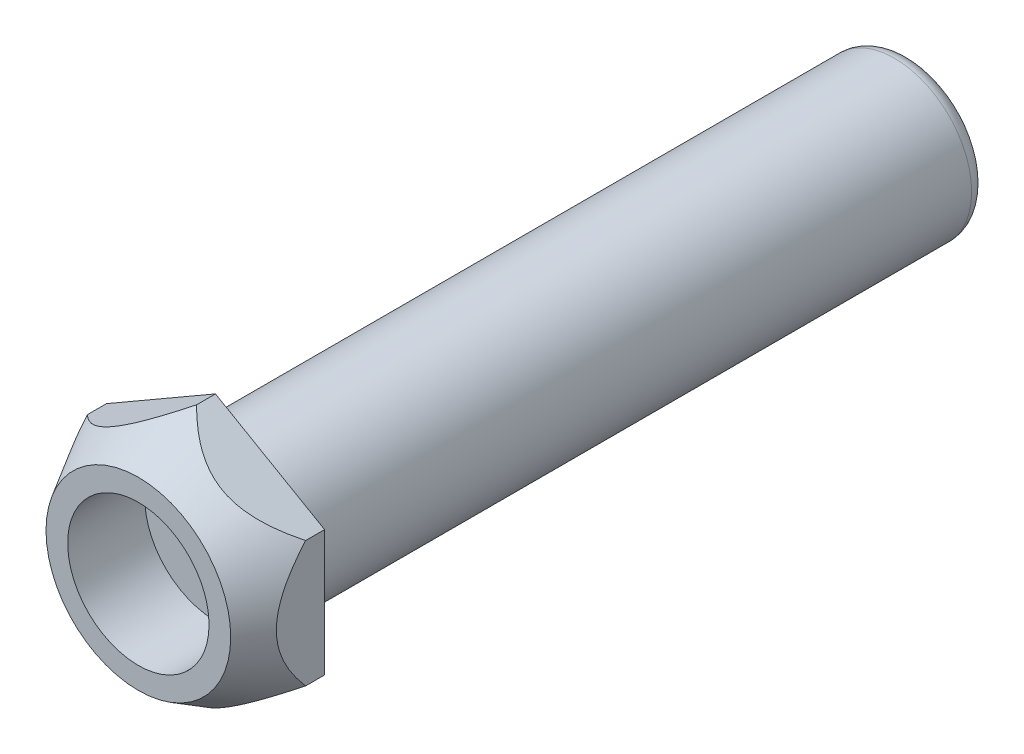
ISO-10303-21;
HEADER;
FILE_DESCRIPTION(('STEP AP214'),'2;1');
FILE_NAME('part.step','',(''),(''),'','','');
FILE_SCHEMA(('AUTOMOTIVE_DESIGN { 1 0 10303 214 1 1 1 1 }'));
ENDSEC;
DATA;
#1=APPLICATION_CONTEXT('core data for automotive mechanical design processes');
#2=APPLICATION_PROTOCOL_DEFINITION('international standard','automotive_design',2000,#1);
#3=PRODUCT_CONTEXT('',#1,'mechanical');
#4=PRODUCT('Part','Part','',(#3));
#5=PRODUCT_RELATED_PRODUCT_CATEGORY('part','',(#4));
#6=PRODUCT_DEFINITION_FORMATION('','',#4);
#7=PRODUCT_DEFINITION_CONTEXT('part definition',#1,'design');
#8=PRODUCT_DEFINITION('design','',#6,#7);
#9=PRODUCT_DEFINITION_SHAPE('','',#8);
#10=(LENGTH_UNIT() NAMED_UNIT(*) SI_UNIT(.MILLI.,.METRE.));
#11=(NAMED_UNIT(*) PLANE_ANGLE_UNIT() SI_UNIT($,.RADIAN.));
#12=(NAMED_UNIT(*) SI_UNIT($,.STERADIAN.) SOLID_ANGLE_UNIT());
#13=UNCERTAINTY_MEASURE_WITH_UNIT(LENGTH_MEASURE(1.E-05),#10,'distance_accuracy_value','');
#14=(GEOMETRIC_REPRESENTATION_CONTEXT(3) GLOBAL_UNCERTAINTY_ASSIGNED_CONTEXT((#13)) GLOBAL_UNIT_ASSIGNED_CONTEXT((#10,
#11,#12)) REPRESENTATION_CONTEXT('',''));
#15=CARTESIAN_POINT('',(0.,0.,0.));
#16=DIRECTION('',(0.,0.,1.));
#17=DIRECTION('',(1.,0.,0.));
#18=AXIS2_PLACEMENT_3D('',#15,#16,#17);
#19=CARTESIAN_POINT('',(1.41363071627622,0.816160074576822,10.));
#20=DIRECTION('',(-0.499999999999995,-0.866025403784441,0.));
#21=DIRECTION('',(0.866025403784442,-0.499999999999995,0.));
#22=AXIS2_PLACEMENT_3D('',#19,#20,#21);
#23=PLANE('',#22);
#24=CARTESIAN_POINT('',(1.41383071627622,0.816044604522984,9.245778281989));
#25=CARTESIAN_POINT('',(1.38425614100578,0.83311949351654,9.27532365935503));
#26=CARTESIAN_POINT('',(1.35409015869044,0.850535831526675,9.30413732051481));
#27=CARTESIAN_POINT('',(1.29219428894102,0.886271428588227,9.35982796014707));
#28=CARTESIAN_POINT('',(1.26045693797109,0.904594996714079,9.38669382478974));
#29=CARTESIAN_POINT('',(1.19450583923613,0.942671881322059,9.43834695421823));
#30=CARTESIAN_POINT('',(1.16024929116499,0.962449908572441,9.46306256360795));
#31=CARTESIAN_POINT('',(1.08989768208299,1.00306742901386,9.50854885324181));
#32=CARTESIAN_POINT('',(1.05380691374877,1.02390444382688,9.52932825096843));
#33=CARTESIAN_POINT('',(0.97640466372232,1.06859265371553,9.56731237644814));
#34=CARTESIAN_POINT('',(0.934913001845885,1.09254787586902,9.58404318937878));
#35=CARTESIAN_POINT('',(0.850404703927267,1.14133876442109,9.60937404665424));
#36=CARTESIAN_POINT('',(0.80740342524014,1.1661655642466,9.61803986142821));
#37=CARTESIAN_POINT('',(0.720330124477487,1.21643735788114,9.62616470344395));
#38=CARTESIAN_POINT('',(0.676251950045994,1.24188590375455,9.62554020648526));
#39=CARTESIAN_POINT('',(0.588868807362534,1.29233658470548,9.6149793979724));
#40=CARTESIAN_POINT('',(0.545566166630254,1.31733737598889,9.60501870163715));
#41=CARTESIAN_POINT('',(0.448727164355875,1.37324740002005,9.57326161446597));
#42=CARTESIAN_POINT('',(0.395846294433655,1.40377818450463,9.5488781335688));
#43=CARTESIAN_POINT('',(0.293822069153136,1.4626818984342,9.49106565081394));
#44=CARTESIAN_POINT('',(0.244697653758156,1.49104389288627,9.45759424609606));
#45=CARTESIAN_POINT('',(0.162518521424671,1.53849003706078,9.39443938206485));
#46=CARTESIAN_POINT('',(0.12865946430821,1.55803857280147,9.36610875447559));
#47=CARTESIAN_POINT('',(0.0629273911500877,1.59598900293371,9.30736563021002));
#48=CARTESIAN_POINT('',(0.0310362061307781,1.61440138718938,9.27698038824923));
#49=CARTESIAN_POINT('',(-0.000199999999999906,1.63243561920745,9.245778281989));
#50=B_SPLINE_CURVE_WITH_KNOTS('',3,(#24,#25,#26,#27,#28,#29,#30,#31,#32,#33,#34,#35,#36,#37,#38,
#39,#40,#41,#42,#43,#44,#45,#46,#47,#48,#49),.UNSPECIFIED.,.F.,.F.,(4,2,2,2,2,2,2,2,2,2,2,2,4),
(0.,0.135515672528433,0.271751997379159,0.411508900210153,0.550952570640002,0.702636958000987,
0.853073225572081,1.00486279583596,1.15704992617521,1.35318163813894,1.55024468173202,
1.69499983896404,1.83811330662084),.UNSPECIFIED.);
#51=CARTESIAN_POINT('',(1.41363071627622,0.816160074576825,9.24597830320945));
#52=VERTEX_POINT('',#51);
#53=CARTESIAN_POINT('',(0.,1.63232014915361,9.24597830320945));
#54=VERTEX_POINT('',#53);
#55=EDGE_CURVE('E89',#52,#54,#50,.T.);
#56=ORIENTED_EDGE('',*,*,#55,.F.);
#57=DIRECTION('',(0.,0.,-1.));
#58=VECTOR('',#57,1.);
#59=CARTESIAN_POINT('',(1.41363071627622,0.816160074576822,10.));
#60=LINE('',#59,#58);
#61=CARTESIAN_POINT('',(1.41363071627622,0.816160074576822,9.));
#62=VERTEX_POINT('',#61);
#63=EDGE_CURVE('E58',#52,#62,#60,.T.);
#64=ORIENTED_EDGE('',*,*,#63,.T.);
#65=DIRECTION('',(-0.866025403784441,0.499999999999995,0.));
#66=VECTOR('',#65,1.);
#67=CARTESIAN_POINT('',(1.41363071627622,0.816160074576822,9.));
#68=LINE('',#67,#66);
#69=CARTESIAN_POINT('',(0.,1.63232014915361,9.));
#70=VERTEX_POINT('',#69);
#71=EDGE_CURVE('E221',#62,#70,#68,.T.);
#72=ORIENTED_EDGE('',*,*,#71,.T.);
#73=DIRECTION('',(0.,0.,-1.));
#74=VECTOR('',#73,1.);
#75=CARTESIAN_POINT('',(0.,1.63232014915361,10.));
#76=LINE('',#75,#74);
#77=EDGE_CURVE('E96',#54,#70,#76,.T.);
#78=ORIENTED_EDGE('',*,*,#77,.F.);
#79=EDGE_LOOP('',(#56,#64,#72,#78));
#80=FACE_BOUND('',#79,.T.);
#81=ADVANCED_FACE('F35',(#80),#23,.F.);
#82=CARTESIAN_POINT('',(0.,1.63232014915361,10.));
#83=DIRECTION('',(0.500000000000001,-0.866025403784438,0.));
#84=DIRECTION('',(0.866025403784438,0.500000000000001,0.));
#85=AXIS2_PLACEMENT_3D('',#82,#83,#84);
#86=PLANE('',#85);
#87=CARTESIAN_POINT('',(0.000199999999999957,1.63243561920745,9.245778281989));
#88=CARTESIAN_POINT('',(-0.0293745752704384,1.61536073021389,9.27532365935503));
#89=CARTESIAN_POINT('',(-0.0595405575857858,1.59794439220376,9.30413732051481));
#90=CARTESIAN_POINT('',(-0.121436427335203,1.5622087951422,9.35982796014707));
#91=CARTESIAN_POINT('',(-0.153173778305128,1.54388522701635,9.38669382478974));
#92=CARTESIAN_POINT('',(-0.219124877040087,1.50580834240837,9.43834695421823));
#93=CARTESIAN_POINT('',(-0.25338142511123,1.48603031515799,9.46306256360795));
#94=CARTESIAN_POINT('',(-0.323733034193232,1.44541279471657,9.50854885324181));
#95=CARTESIAN_POINT('',(-0.359823802527451,1.42457577990355,9.52932825096843));
#96=CARTESIAN_POINT('',(-0.437226052553896,1.3798875700149,9.56731237644814));
#97=CARTESIAN_POINT('',(-0.478717714430331,1.35593234786142,9.58404318937878));
#98=CARTESIAN_POINT('',(-0.563226012348948,1.30714145930934,9.60937404665425));
#99=CARTESIAN_POINT('',(-0.606227291036075,1.28231465948383,9.61803986142822));
#100=CARTESIAN_POINT('',(-0.693300591798728,1.23204286584929,9.62616470344396));
#101=CARTESIAN_POINT('',(-0.737378766230221,1.20659431997588,9.62554020648527));
#102=CARTESIAN_POINT('',(-0.824761908913681,1.15614363902495,9.61497939797241));
#103=CARTESIAN_POINT('',(-0.868064549645961,1.13114284774154,9.60501870163716));
#104=CARTESIAN_POINT('',(-0.964903551920339,1.07523282371037,9.57326161446598));
#105=CARTESIAN_POINT('',(-1.01778442184256,1.0447020392258,9.54887813356882));
#106=CARTESIAN_POINT('',(-1.11980864712308,0.985798325296231,9.49106565081395));
#107=CARTESIAN_POINT('',(-1.16893306251805,0.957436330844157,9.45759424609608));
#108=CARTESIAN_POINT('',(-1.25111219485154,0.909990186669647,9.39443938206487));
#109=CARTESIAN_POINT('',(-1.28497125196801,0.890441650928949,9.3661087544756));
#110=CARTESIAN_POINT('',(-1.35070332512614,0.85249122079671,9.30736563021003));
#111=CARTESIAN_POINT('',(-1.38259451014545,0.834078836541033,9.27698038824923));
#112=CARTESIAN_POINT('',(-1.41383071627623,0.816044604522964,9.245778281989));
#113=B_SPLINE_CURVE_WITH_KNOTS('',3,(#87,#88,#89,#90,#91,#92,#93,#94,#95,#96,#97,#98,#99,#100,
#101,#102,#103,#104,#105,#106,#107,#108,#109,#110,#111,#112),.UNSPECIFIED.,.F.,.F.,(4,2,2,2,2,2,
2,2,2,2,2,2,4),(0.,0.135515672528433,0.271751997379159,0.411508900210152,0.550952570640001,
0.702636958000986,0.85307322557208,1.00486279583596,1.15704992617521,1.35318163813894,
1.55024468173201,1.69499983896405,1.83811330662087),.UNSPECIFIED.);
#114=CARTESIAN_POINT('',(-1.41363071627623,0.816160074576806,9.24597830320945));
#115=VERTEX_POINT('',#114);
#116=EDGE_CURVE('E98',#54,#115,#113,.T.);
#117=ORIENTED_EDGE('',*,*,#116,.F.);
#118=ORIENTED_EDGE('',*,*,#77,.T.);
#119=DIRECTION('',(-0.866025403784438,-0.500000000000001,0.));
#120=VECTOR('',#119,1.);
#121=CARTESIAN_POINT('',(0.,1.63232014915361,9.));
#122=LINE('',#121,#120);
#123=CARTESIAN_POINT('',(-1.41363071627623,0.816160074576802,9.));
#124=VERTEX_POINT('',#123);
#125=EDGE_CURVE('E224',#70,#124,#122,.T.);
#126=ORIENTED_EDGE('',*,*,#125,.T.);
#127=DIRECTION('',(0.,0.,-1.));
#128=VECTOR('',#127,1.);
#129=CARTESIAN_POINT('',(-1.41363071627623,0.816160074576802,10.));
#130=LINE('',#129,#128);
#131=EDGE_CURVE('E115',#115,#124,#130,.T.);
#132=ORIENTED_EDGE('',*,*,#131,.F.);
#133=EDGE_LOOP('',(#117,#118,#126,#132));
#134=FACE_BOUND('',#133,.T.);
#135=ADVANCED_FACE('F137',(#134),#86,.F.);
#136=CARTESIAN_POINT('',(-1.41363071627623,0.816160074576802,10.));
#137=DIRECTION('',(1.,0.,0.));
#138=DIRECTION('',(0.,1.,0.));
#139=AXIS2_PLACEMENT_3D('',#136,#137,#138);
#140=PLANE('',#139);
#141=CARTESIAN_POINT('',(-1.41363071627622,-1.67905290733659,8.27156755066952));
#142=CARTESIAN_POINT('',(-1.41363071627622,-1.64433972294282,8.31755825036936));
#143=CARTESIAN_POINT('',(-1.41363071627622,-1.60934772309907,8.36333645158738));
#144=CARTESIAN_POINT('',(-1.41363071627622,-1.53869136637997,8.45438651279615));
#145=CARTESIAN_POINT('',(-1.41363071627622,-1.50302686501682,8.49965826056778));
#146=CARTESIAN_POINT('',(-1.41363071627622,-1.39420278336073,8.63540065032796));
#147=CARTESIAN_POINT('',(-1.41363071627623,-1.31985613636175,8.72493687729335));
#148=CARTESIAN_POINT('',(-1.41363071627623,-1.20040420037576,8.86155928502252));
#149=CARTESIAN_POINT('',(-1.41363071627623,-1.1568316775646,8.90998379556318));
#150=CARTESIAN_POINT('',(-1.41363071627623,-1.06794149136101,9.00519817209435));
#151=CARTESIAN_POINT('',(-1.41363071627623,-1.02262416626113,9.05198835163671));
#152=CARTESIAN_POINT('',(-1.41363071627623,-0.929973141508732,9.14317779435519));
#153=CARTESIAN_POINT('',(-1.41363071627623,-0.882647932076212,9.18758561657901));
#154=CARTESIAN_POINT('',(-1.41363071627623,-0.785277285747756,9.2732852497112));
#155=CARTESIAN_POINT('',(-1.41363071627623,-0.735233859393239,9.31457931115695));
#156=CARTESIAN_POINT('',(-1.41363071627623,-0.647541028027813,9.38068126748988));
#157=CARTESIAN_POINT('',(-1.41363071627623,-0.610790858794825,9.40666445443446));
#158=CARTESIAN_POINT('',(-1.41363071627623,-0.535407563089157,9.45573193352089));
#159=CARTESIAN_POINT('',(-1.41363071627623,-0.496773352421217,9.47881452849141));
#160=CARTESIAN_POINT('',(-1.41363071627623,-0.379235024452393,9.54139912297399));
#161=CARTESIAN_POINT('',(-1.41363071627623,-0.297102270575759,9.57553490232616));
#162=CARTESIAN_POINT('',(-1.41363071627623,-0.164947643503545,9.60945613007413));
#163=CARTESIAN_POINT('',(-1.41363071627623,-0.117135854995222,9.61778915185238));
#164=CARTESIAN_POINT('',(-1.41363071627623,-0.0207241784356564,9.62591174161212));
#165=CARTESIAN_POINT('',(-1.41363071627623,0.0278760682234975,9.6256973065647));
#166=CARTESIAN_POINT('',(-1.41363071627623,0.124107917844637,9.61675126259581));
#167=CARTESIAN_POINT('',(-1.41363071627623,0.171741877170197,9.6080438122772));
#168=CARTESIAN_POINT('',(-1.41363071627623,0.265084706082082,9.58337017562073));
#169=CARTESIAN_POINT('',(-1.41363071627623,0.310791179201756,9.56739522830039));
#170=CARTESIAN_POINT('',(-1.41363071627623,0.393133274254891,9.53263696482176));
#171=CARTESIAN_POINT('',(-1.41363071627623,0.430105745409773,9.51462671915031));
#172=CARTESIAN_POINT('',(-1.41363071627623,0.502348495388917,9.47543593921672));
#173=CARTESIAN_POINT('',(-1.41363071627623,0.537617390876578,9.45425288395955));
#174=CARTESIAN_POINT('',(-1.41363071627623,0.606909366464346,9.40923068058328));
#175=CARTESIAN_POINT('',(-1.41363071627623,0.640916130581831,9.38536671296083));
#176=CARTESIAN_POINT('',(-1.41363071627623,0.70747475805378,9.33573760625262));
#177=CARTESIAN_POINT('',(-1.41363071627623,0.740027291661078,9.30997335782715));
#178=CARTESIAN_POINT('',(-1.41363071627623,0.831306186739143,9.23421057091305));
#179=CARTESIAN_POINT('',(-1.41363071627623,0.888517330432571,9.18239134897363));
#180=CARTESIAN_POINT('',(-1.41363071627623,0.999733307525385,9.07539615519459));
#181=CARTESIAN_POINT('',(-1.41363071627623,1.05373540917745,9.02021740215118));
#182=CARTESIAN_POINT('',(-1.41363071627623,1.15946313014512,8.90734215360245));
#183=CARTESIAN_POINT('',(-1.41363071627623,1.21117938529195,8.84963693925886));
#184=CARTESIAN_POINT('',(-1.41363071627623,1.31268462371257,8.73255352108331));
#185=CARTESIAN_POINT('',(-1.41363071627623,1.36247334631048,8.67317509283224));
#186=CARTESIAN_POINT('',(-1.41363071627623,1.45657765512383,8.55800663468814));
#187=CARTESIAN_POINT('',(-1.41363071627623,1.50101117203878,8.50231255727611));
#188=CARTESIAN_POINT('',(-1.41363071627624,1.58882865089946,8.39009550465013));
#189=CARTESIAN_POINT('',(-1.41363071627624,1.63221250197877,8.33357244288222));
#190=CARTESIAN_POINT('',(-1.41363071627624,1.7177239819946,8.22038143664004));
#191=CARTESIAN_POINT('',(-1.41363071627624,1.75985939607326,8.16371935796784));
#192=CARTESIAN_POINT('',(-1.41363071627624,1.84339896046617,8.04987703434243));
#193=CARTESIAN_POINT('',(-1.41363071627624,1.88480326665836,7.99269690387368));
#194=CARTESIAN_POINT('',(-1.41363071627624,1.92591280094488,7.93530839793996));
#195=B_SPLINE_CURVE_WITH_KNOTS('',3,(#141,#142,#143,#144,#145,#146,#147,#148,#149,#150,#151,
#152,#153,#154,#155,#156,#157,#158,#159,#160,#161,#162,#163,#164,#165,#166,#167,#168,#169,#170,
#171,#172,#173,#174,#175,#176,#177,#178,#179,#180,#181,#182,#183,#184,#185,#186,#187,#188,#189,
#190,#191,#192,#193,#194),.UNSPECIFIED.,.F.,.F.,(4,2,2,2,2,2,2,2,2,2,2,2,2,2,2,2,2,2,2,2,2,2,2,
2,2,2,4),(0.,0.172856779133159,0.345751129753997,0.694764818367423,0.890159904291273,
1.0855172947785,1.28011798063293,1.47457663897939,1.60946765115293,1.7444372257759,
2.00827760729503,2.15321273123484,2.29821573341235,2.44280747008501,2.58757397617742,
2.71077096669131,2.8340663693338,2.95861557424437,3.0831067695178,3.31444645232385,
3.54598032585764,3.77838831603819,4.01082762761954,4.22455434898042,4.43830354661753,
4.65013203985738,4.86191481057648),.UNSPECIFIED.);
#196=CARTESIAN_POINT('',(-1.41363071627623,-0.816160074576812,9.24597830320945));
#197=VERTEX_POINT('',#196);
#198=EDGE_CURVE('E190',#115,#197,#195,.F.);
#199=ORIENTED_EDGE('',*,*,#198,.F.);
#200=ORIENTED_EDGE('',*,*,#131,.T.);
#201=DIRECTION('',(0.,-1.,0.));
#202=VECTOR('',#201,1.);
#203=CARTESIAN_POINT('',(-1.41363071627623,0.816160074576802,9.));
#204=LINE('',#203,#202);
#205=CARTESIAN_POINT('',(-1.41363071627623,-0.816160074576812,9.));
#206=VERTEX_POINT('',#205);
#207=EDGE_CURVE('E227',#124,#206,#204,.T.);
#208=ORIENTED_EDGE('',*,*,#207,.T.);
#209=DIRECTION('',(0.,0.,-1.));
#210=VECTOR('',#209,1.);
#211=CARTESIAN_POINT('',(-1.41363071627623,-0.816160074576812,10.));
#212=LINE('',#211,#210);
#213=EDGE_CURVE('E113',#197,#206,#212,.T.);
#214=ORIENTED_EDGE('',*,*,#213,.F.);
#215=EDGE_LOOP('',(#199,#200,#208,#214));
#216=FACE_BOUND('',#215,.T.);
#217=ADVANCED_FACE('F142',(#216),#140,.F.);
#218=CARTESIAN_POINT('',(-1.41363071627623,-0.816160074576812,10.));
#219=DIRECTION('',(0.499999999999995,0.866025403784441,0.));
#220=DIRECTION('',(-0.866025403784442,0.499999999999995,0.));
#221=AXIS2_PLACEMENT_3D('',#218,#219,#220);
#222=PLANE('',#221);
#223=CARTESIAN_POINT('',(-1.41383071627623,-0.816044604522974,9.245778281989));
#224=CARTESIAN_POINT('',(-1.38425614100579,-0.83311949351653,9.27532365935503));
#225=CARTESIAN_POINT('',(-1.35409015869044,-0.850535831526665,9.30413732051481));
#226=CARTESIAN_POINT('',(-1.29219428894102,-0.886271428588217,9.35982796014707));
#227=CARTESIAN_POINT('',(-1.2604569379711,-0.90459499671407,9.38669382478974));
#228=CARTESIAN_POINT('',(-1.19450583923614,-0.942671881322049,9.43834695421823));
#229=CARTESIAN_POINT('',(-1.16024929116499,-0.962449908572431,9.46306256360795));
#230=CARTESIAN_POINT('',(-1.08989768208299,-1.00306742901385,9.50854885324181));
#231=CARTESIAN_POINT('',(-1.05380691374877,-1.02390444382687,9.52932825096843));
#232=CARTESIAN_POINT('',(-0.976404663722329,-1.06859265371552,9.56731237644814));
#233=CARTESIAN_POINT('',(-0.934913001845895,-1.092547875869,9.58404318937878));
#234=CARTESIAN_POINT('',(-0.850404703927276,-1.14133876442107,9.60937404665425));
#235=CARTESIAN_POINT('',(-0.807403425240149,-1.16616556424658,9.61803986142822));
#236=CARTESIAN_POINT('',(-0.720330124477496,-1.21643735788113,9.62616470344396));
#237=CARTESIAN_POINT('',(-0.676251950046003,-1.24188590375454,9.62554020648527));
#238=CARTESIAN_POINT('',(-0.588868807362542,-1.29233658470547,9.61497939797241));
#239=CARTESIAN_POINT('',(-0.545566166630262,-1.31733737598887,9.60501870163716));
#240=CARTESIAN_POINT('',(-0.448727164355883,-1.37324740002004,9.57326161446598));
#241=CARTESIAN_POINT('',(-0.395846294433664,-1.40377818450461,9.54887813356882));
#242=CARTESIAN_POINT('',(-0.293822069153148,-1.46268189843418,9.49106565081395));
#243=CARTESIAN_POINT('',(-0.244697653758168,-1.49104389288626,9.45759424609608));
#244=CARTESIAN_POINT('',(-0.162518521424679,-1.53849003706077,9.39443938206487));
#245=CARTESIAN_POINT('',(-0.128659464308214,-1.55803857280146,9.3661087544756));
#246=CARTESIAN_POINT('',(-0.0629273911500826,-1.5959890029337,9.30736563021003));
#247=CARTESIAN_POINT('',(-0.0310362061307695,-1.61440138718938,9.27698038824923));
#248=CARTESIAN_POINT('',(0.000200000000011592,-1.63243561920745,9.245778281989));
#249=B_SPLINE_CURVE_WITH_KNOTS('',3,(#223,#224,#225,#226,#227,#228,#229,#230,#231,#232,#233,
#234,#235,#236,#237,#238,#239,#240,#241,#242,#243,#244,#245,#246,#247,#248),.UNSPECIFIED.,.F.,
.F.,(4,2,2,2,2,2,2,2,2,2,2,2,4),(0.,0.135515672528434,0.271751997379161,0.411508900210154,
0.550952570640001,0.702636958000987,0.853073225572081,1.00486279583596,1.15704992617521,
1.35318163813894,1.55024468173201,1.69499983896405,1.83811330662087),.UNSPECIFIED.);
#250=CARTESIAN_POINT('',(0.,-1.63232014915361,9.24597830320945));
#251=VERTEX_POINT('',#250);
#252=EDGE_CURVE('E185',#197,#251,#249,.T.);
#253=ORIENTED_EDGE('',*,*,#252,.F.);
#254=ORIENTED_EDGE('',*,*,#213,.T.);
#255=DIRECTION('',(0.866025403784441,-0.499999999999995,0.));
#256=VECTOR('',#255,1.);
#257=CARTESIAN_POINT('',(-1.41363071627623,-0.816160074576812,9.));
#258=LINE('',#257,#256);
#259=CARTESIAN_POINT('',(0.,-1.63232014915361,9.));
#260=VERTEX_POINT('',#259);
#261=EDGE_CURVE('E230',#206,#260,#258,.T.);
#262=ORIENTED_EDGE('',*,*,#261,.T.);
#263=DIRECTION('',(0.,0.,-1.));
#264=VECTOR('',#263,1.);
#265=CARTESIAN_POINT('',(0.,-1.63232014915361,10.));
#266=LINE('',#265,#264);
#267=EDGE_CURVE('E106',#251,#260,#266,.T.);
#268=ORIENTED_EDGE('',*,*,#267,.F.);
#269=EDGE_LOOP('',(#253,#254,#262,#268));
#270=FACE_BOUND('',#269,.T.);
#271=ADVANCED_FACE('F196',(#270),#222,.F.);
#272=CARTESIAN_POINT('',(0.,-1.63232014915361,10.));
#273=DIRECTION('',(-0.500000000000007,0.866025403784434,0.));
#274=DIRECTION('',(-0.866025403784434,-0.500000000000007,0.));
#275=AXIS2_PLACEMENT_3D('',#272,#273,#274);
#276=PLANE('',#275);
#277=CARTESIAN_POINT('',(-0.000199999999988556,-1.63243561920745,9.245778281989));
#278=CARTESIAN_POINT('',(0.0293745752704493,-1.61536073021389,9.27532365935503));
#279=CARTESIAN_POINT('',(0.0595405575857969,-1.59794439220376,9.30413732051481));
#280=CARTESIAN_POINT('',(0.121436427335215,-1.5622087951422,9.35982796014707));
#281=CARTESIAN_POINT('',(0.15317377830514,-1.54388522701635,9.38669382478974));
#282=CARTESIAN_POINT('',(0.219124877040098,-1.50580834240837,9.43834695421823));
#283=CARTESIAN_POINT('',(0.253381425111242,-1.48603031515799,9.46306256360795));
#284=CARTESIAN_POINT('',(0.323733034193242,-1.44541279471657,9.50854885324181));
#285=CARTESIAN_POINT('',(0.359823802527461,-1.42457577990355,9.52932825096843));
#286=CARTESIAN_POINT('',(0.437226052553905,-1.3798875700149,9.56731237644814));
#287=CARTESIAN_POINT('',(0.47871771443034,-1.35593234786141,9.58404318937878));
#288=CARTESIAN_POINT('',(0.563226012348957,-1.30714145930934,9.60937404665425));
#289=CARTESIAN_POINT('',(0.606227291036084,-1.28231465948383,9.61803986142822));
#290=CARTESIAN_POINT('',(0.693300591798736,-1.23204286584928,9.62616470344396));
#291=CARTESIAN_POINT('',(0.737378766230228,-1.20659431997587,9.62554020648527));
#292=CARTESIAN_POINT('',(0.824761908913688,-1.15614363902494,9.61497939797241));
#293=CARTESIAN_POINT('',(0.868064549645967,-1.13114284774154,9.60501870163716));
#294=CARTESIAN_POINT('',(0.964903551920345,-1.07523282371037,9.57326161446598));
#295=CARTESIAN_POINT('',(1.01778442184256,-1.04470203922579,9.54887813356882));
#296=CARTESIAN_POINT('',(1.11980864712308,-0.985798325296225,9.49106565081396));
#297=CARTESIAN_POINT('',(1.16893306251806,-0.95743633084415,9.45759424609609));
#298=CARTESIAN_POINT('',(1.25111219485155,-0.90999018666964,9.39443938206487));
#299=CARTESIAN_POINT('',(1.28497125196801,-0.890441650928942,9.36610875447561));
#300=CARTESIAN_POINT('',(1.35070332512614,-0.852491220796702,9.30736563021003));
#301=CARTESIAN_POINT('',(1.38259451014546,-0.834078836541024,9.27698038824924));
#302=CARTESIAN_POINT('',(1.41383071627624,-0.816044604522955,9.24577828198901));
#303=B_SPLINE_CURVE_WITH_KNOTS('',3,(#277,#278,#279,#280,#281,#282,#283,#284,#285,#286,#287,
#288,#289,#290,#291,#292,#293,#294,#295,#296,#297,#298,#299,#300,#301,#302),.UNSPECIFIED.,.F.,
.F.,(4,2,2,2,2,2,2,2,2,2,2,2,4),(0.,0.135515672528434,0.271751997379161,0.411508900210153,
0.550952570640001,0.702636958000986,0.85307322557208,1.00486279583596,1.15704992617521,
1.35318163813893,1.55024468173201,1.69499983896404,1.83811330662087),.UNSPECIFIED.);
#304=CARTESIAN_POINT('',(1.41363071627624,-0.816160074576792,9.24597830320945));
#305=VERTEX_POINT('',#304);
#306=EDGE_CURVE('E50',#251,#305,#303,.T.);
#307=ORIENTED_EDGE('',*,*,#306,.F.);
#308=ORIENTED_EDGE('',*,*,#267,.T.);
#309=DIRECTION('',(0.866025403784434,0.500000000000007,0.));
#310=VECTOR('',#309,1.);
#311=CARTESIAN_POINT('',(0.,-1.63232014915361,9.));
#312=LINE('',#311,#310);
#313=CARTESIAN_POINT('',(1.41363071627624,-0.816160074576792,9.));
#314=VERTEX_POINT('',#313);
#315=EDGE_CURVE('E108',#260,#314,#312,.T.);
#316=ORIENTED_EDGE('',*,*,#315,.T.);
#317=DIRECTION('',(0.,0.,-1.));
#318=VECTOR('',#317,1.);
#319=CARTESIAN_POINT('',(1.41363071627624,-0.816160074576792,10.));
#320=LINE('',#319,#318);
#321=EDGE_CURVE('E104',#305,#314,#320,.T.);
#322=ORIENTED_EDGE('',*,*,#321,.F.);
#323=EDGE_LOOP('',(#307,#308,#316,#322));
#324=FACE_BOUND('',#323,.T.);
#325=ADVANCED_FACE('F200',(#324),#276,.F.);
#326=CARTESIAN_POINT('',(1.41363071627624,-0.816160074576792,10.));
#327=DIRECTION('',(-1.,0.,0.));
#328=DIRECTION('',(0.,-1.,0.));
#329=AXIS2_PLACEMENT_3D('',#326,#327,#328);
#330=PLANE('',#329);
#331=CARTESIAN_POINT('',(1.41363071627625,-1.67905290964422,8.27156754761191));
#332=CARTESIAN_POINT('',(1.41363071627625,-1.64433972519133,8.31755824741631));
#333=CARTESIAN_POINT('',(1.41363071627625,-1.60934772528823,8.36333644873882));
#334=CARTESIAN_POINT('',(1.41363071627625,-1.53869136844975,8.45438651015643));
#335=CARTESIAN_POINT('',(1.41363071627625,-1.50302686702658,8.49965825803238));
#336=CARTESIAN_POINT('',(1.41363071627624,-1.39420278518643,8.63540064810901));
#337=CARTESIAN_POINT('',(1.41363071627624,-1.31985613806205,8.72493687528601));
#338=CARTESIAN_POINT('',(1.41363071627624,-1.20040420185405,8.86155928336646));
#339=CARTESIAN_POINT('',(1.41363071627624,-1.15683167894806,8.90998379404733));
#340=CARTESIAN_POINT('',(1.41363071627624,-1.06794149254959,9.00519817085525));
#341=CARTESIAN_POINT('',(1.41363071627624,-1.02262416734967,9.05198835053412));
#342=CARTESIAN_POINT('',(1.41363071627624,-0.929973142390458,9.14317779351844));
#343=CARTESIAN_POINT('',(1.41363071627624,-0.882647932851223,9.18758561587163));
#344=CARTESIAN_POINT('',(1.41363071627624,-0.785277286298432,9.27328524925185));
#345=CARTESIAN_POINT('',(1.41363071627624,-0.73523385982631,9.31457931081628));
#346=CARTESIAN_POINT('',(1.41363071627624,-0.647541028293768,9.38068126729919));
#347=CARTESIAN_POINT('',(1.41363071627624,-0.610790859017608,9.4066644542829));
#348=CARTESIAN_POINT('',(1.41363071627624,-0.535407563221176,9.45573193344154));
#349=CARTESIAN_POINT('',(1.41363071627623,-0.496773352505635,9.47881452844512));
#350=CARTESIAN_POINT('',(1.41363071627623,-0.37923502439315,9.54139912300811));
#351=CARTESIAN_POINT('',(1.41363071627623,-0.29710227041215,9.57553490239561));
#352=CARTESIAN_POINT('',(1.41363071627623,-0.164947643236581,9.60945613012755));
#353=CARTESIAN_POINT('',(1.41363071627623,-0.117135854735336,9.61778915188909));
#354=CARTESIAN_POINT('',(1.41363071627623,-0.0207241781924254,9.62591174161785));
#355=CARTESIAN_POINT('',(1.41363071627623,0.0278760684571581,9.62569730655607));
#356=CARTESIAN_POINT('',(1.41363071627623,0.124107918056507,9.61675126256303));
#357=CARTESIAN_POINT('',(1.41363071627623,0.171741877369864,9.60804381223475));
#358=CARTESIAN_POINT('',(1.41363071627623,0.265084706257004,9.58337017556412));
#359=CARTESIAN_POINT('',(1.41363071627623,0.310791179364139,9.56739522823932));
#360=CARTESIAN_POINT('',(1.41363071627623,0.393133274415195,9.53263696474773));
#361=CARTESIAN_POINT('',(1.41363071627623,0.43010574557946,9.51462671906503));
#362=CARTESIAN_POINT('',(1.41363071627622,0.502348495576405,9.47543593910825));
#363=CARTESIAN_POINT('',(1.41363071627622,0.537617391072483,9.45425288383914));
#364=CARTESIAN_POINT('',(1.41363071627622,0.606909366676528,9.40923068043849));
#365=CARTESIAN_POINT('',(1.41363071627622,0.640916130801864,9.38536671280362));
#366=CARTESIAN_POINT('',(1.41363071627622,0.707474758289006,9.33573760607042));
#367=CARTESIAN_POINT('',(1.41363071627622,0.740027291903645,9.3099733576324));
#368=CARTESIAN_POINT('',(1.41363071627622,0.831306187021709,9.23421057066623));
#369=CARTESIAN_POINT('',(1.41363071627622,0.888517330745999,9.1823913486856));
#370=CARTESIAN_POINT('',(1.41363071627622,0.999733307898202,9.07539615482251));
#371=CARTESIAN_POINT('',(1.41363071627622,1.05373540957879,9.02021740173629));
#372=CARTESIAN_POINT('',(1.41363071627622,1.15946313060218,8.90734215310092));
#373=CARTESIAN_POINT('',(1.41363071627622,1.21117938577619,8.84963693871354));
#374=CARTESIAN_POINT('',(1.41363071627622,1.31268462425025,8.73255352044995));
#375=CARTESIAN_POINT('',(1.41363071627622,1.36247334687442,8.67317509215465));
#376=CARTESIAN_POINT('',(1.41363071627621,1.45657765573619,8.5580066339272));
#377=CARTESIAN_POINT('',(1.41363071627621,1.50101117267338,8.50231255647609));
#378=CARTESIAN_POINT('',(1.41363071627621,1.58882865157827,8.39009550377188));
#379=CARTESIAN_POINT('',(1.41363071627621,1.63221250267955,8.33357244196482));
#380=CARTESIAN_POINT('',(1.41363071627621,1.71772398273893,8.22038143564467));
#381=CARTESIAN_POINT('',(1.41363071627621,1.75985939683919,8.16371935693365));
#382=CARTESIAN_POINT('',(1.41363071627621,1.84339896127517,8.04987703323059));
#383=CARTESIAN_POINT('',(1.41363071627621,1.88480326748883,7.99269690272301));
#384=CARTESIAN_POINT('',(1.41363071627621,1.92591280179678,7.93530839675048));
#385=B_SPLINE_CURVE_WITH_KNOTS('',3,(#331,#332,#333,#334,#335,#336,#337,#338,#339,#340,#341,
#342,#343,#344,#345,#346,#347,#348,#349,#350,#351,#352,#353,#354,#355,#356,#357,#358,#359,#360,
#361,#362,#363,#364,#365,#366,#367,#368,#369,#370,#371,#372,#373,#374,#375,#376,#377,#378,#379,
#380,#381,#382,#383,#384),.UNSPECIFIED.,.F.,.F.,(4,2,2,2,2,2,2,2,2,2,2,2,2,2,2,2,2,2,2,2,2,2,2,
2,2,2,4),(0.,0.172856779490362,0.345751130468499,0.694764819810672,0.890159906237475,
1.0855172972275,1.28011798358061,1.47457664242471,1.60946765477137,1.74443722956782,
2.0082776114042,2.1532127353146,2.29821573746407,2.44280747410662,2.58757398016852,
2.71077097072239,2.83406637340497,2.95861557835623,3.0831067736703,3.3144464566278,
3.54598033031323,3.77838832064606,4.0108276323797,4.22455435387385,4.43830355164424,
4.65013204501623,4.86191481586744),.UNSPECIFIED.);
#386=EDGE_CURVE('E87',#305,#52,#385,.T.);
#387=ORIENTED_EDGE('',*,*,#386,.F.);
#388=ORIENTED_EDGE('',*,*,#321,.T.);
#389=DIRECTION('',(0.,1.,0.));
#390=VECTOR('',#389,1.);
#391=CARTESIAN_POINT('',(1.41363071627624,-0.816160074576792,9.));
#392=LINE('',#391,#390);
#393=EDGE_CURVE('E102',#314,#62,#392,.T.);
#394=ORIENTED_EDGE('',*,*,#393,.T.);
#395=ORIENTED_EDGE('',*,*,#63,.F.);
#396=EDGE_LOOP('',(#387,#388,#394,#395));
#397=FACE_BOUND('',#396,.T.);
#398=ADVANCED_FACE('F100',(#397),#330,.F.);
#399=CARTESIAN_POINT('',(0.,0.,9.));
#400=DIRECTION('',(0.,0.,-1.));
#401=DIRECTION('',(-1.,0.,0.));
#402=AXIS2_PLACEMENT_3D('',#399,#400,#401);
#403=CYLINDRICAL_SURFACE('',#402,1.);
#404=CARTESIAN_POINT('',(0.,0.,0.200000000000001));
#405=DIRECTION('',(0.,0.,1.));
#406=DIRECTION('',(1.,0.,0.));
#407=AXIS2_PLACEMENT_3D('',#404,#405,#406);
#408=CIRCLE('',#407,1.);
#409=CARTESIAN_POINT('',(1.,0.,0.200000000000001));
#410=VERTEX_POINT('',#409);
#411=EDGE_CURVE('E43',#410,#410,#408,.T.);
#412=ORIENTED_EDGE('',*,*,#411,.T.);
#413=EDGE_LOOP('',(#412));
#414=FACE_BOUND('',#413,.T.);
#415=CARTESIAN_POINT('',(0.,0.,9.));
#416=DIRECTION('',(0.,0.,1.));
#417=DIRECTION('',(1.,0.,0.));
#418=AXIS2_PLACEMENT_3D('',#415,#416,#417);
#419=CIRCLE('',#418,1.);
#420=CARTESIAN_POINT('',(1.,0.,9.));
#421=VERTEX_POINT('',#420);
#422=EDGE_CURVE('E118',#421,#421,#419,.T.);
#423=ORIENTED_EDGE('',*,*,#422,.F.);
#424=EDGE_LOOP('',(#423));
#425=FACE_BOUND('',#424,.T.);
#426=ADVANCED_FACE('F123',(#414,#425),#403,.T.);
#427=CARTESIAN_POINT('',(0.,0.,0.));
#428=DIRECTION('',(0.,0.,1.));
#429=DIRECTION('',(1.,0.,0.));
#430=AXIS2_PLACEMENT_3D('',#427,#428,#429);
#431=PLANE('',#430);
#432=CARTESIAN_POINT('',(0.,0.,0.));
#433=DIRECTION('',(0.,0.,1.));
#434=DIRECTION('',(1.,0.,0.));
#435=AXIS2_PLACEMENT_3D('',#432,#433,#434);
#436=CIRCLE('',#435,0.8);
#437=CARTESIAN_POINT('',(0.8,0.,0.));
#438=VERTEX_POINT('',#437);
#439=EDGE_CURVE('E12',#438,#438,#436,.F.);
#440=ORIENTED_EDGE('',*,*,#439,.T.);
#441=EDGE_LOOP('',(#440));
#442=FACE_BOUND('',#441,.T.);
#443=ADVANCED_FACE('F149',(#442),#431,.F.);
#444=CARTESIAN_POINT('',(0.,0.,9.));
#445=DIRECTION('',(0.,0.,1.));
#446=DIRECTION('',(1.,0.,0.));
#447=AXIS2_PLACEMENT_3D('',#444,#445,#446);
#448=PLANE('',#447);
#449=ORIENTED_EDGE('',*,*,#422,.T.);
#450=EDGE_LOOP('',(#449));
#451=FACE_BOUND('',#450,.T.);
#452=ORIENTED_EDGE('',*,*,#71,.F.);
#453=ORIENTED_EDGE('',*,*,#393,.F.);
#454=ORIENTED_EDGE('',*,*,#315,.F.);
#455=ORIENTED_EDGE('',*,*,#261,.F.);
#456=ORIENTED_EDGE('',*,*,#207,.F.);
#457=ORIENTED_EDGE('',*,*,#125,.F.);
#458=EDGE_LOOP('',(#452,#453,#454,#455,#456,#457));
#459=FACE_BOUND('',#458,.T.);
#460=ADVANCED_FACE('F166',(#451,#459),#448,.F.);
#461=CARTESIAN_POINT('',(0.,0.,10.));
#462=DIRECTION('',(0.,0.,-1.));
#463=DIRECTION('',(1.,0.,0.));
#464=AXIS2_PLACEMENT_3D('',#461,#462,#463);
#465=CONICAL_SURFACE('',#464,1.19698551953677,0.5235987755983);
#466=CARTESIAN_POINT('',(0.,0.,10.));
#467=DIRECTION('',(0.,0.,1.));
#468=DIRECTION('',(1.,0.,0.));
#469=AXIS2_PLACEMENT_3D('',#466,#467,#468);
#470=CIRCLE('',#469,1.19698551953677);
#471=CARTESIAN_POINT('',(1.19698551953677,0.,10.));
#472=VERTEX_POINT('',#471);
#473=EDGE_CURVE('E93',#472,#472,#470,.T.);
#474=ORIENTED_EDGE('',*,*,#473,.F.);
#475=EDGE_LOOP('',(#474));
#476=FACE_BOUND('',#475,.T.);
#477=ORIENTED_EDGE('',*,*,#55,.T.);
#478=ORIENTED_EDGE('',*,*,#116,.T.);
#479=ORIENTED_EDGE('',*,*,#198,.T.);
#480=ORIENTED_EDGE('',*,*,#252,.T.);
#481=ORIENTED_EDGE('',*,*,#306,.T.);
#482=ORIENTED_EDGE('',*,*,#386,.T.);
#483=EDGE_LOOP('',(#477,#478,#479,#480,#481,#482));
#484=FACE_BOUND('',#483,.T.);
#485=ADVANCED_FACE('F88',(#476,#484),#465,.T.);
#486=CARTESIAN_POINT('',(0.,0.,9.));
#487=DIRECTION('',(0.,0.,1.));
#488=DIRECTION('',(1.,0.,0.));
#489=AXIS2_PLACEMENT_3D('',#486,#487,#488);
#490=PLANE('',#489);
#491=CARTESIAN_POINT('',(0.,0.,9.));
#492=DIRECTION('',(0.,0.,1.));
#493=DIRECTION('',(1.,0.,0.));
#494=AXIS2_PLACEMENT_3D('',#491,#492,#493);
#495=CIRCLE('',#494,0.91623072822091);
#496=CARTESIAN_POINT('',(0.91623072822091,0.,9.));
#497=VERTEX_POINT('',#496);
#498=EDGE_CURVE('E160',#497,#497,#495,.T.);
#499=ORIENTED_EDGE('',*,*,#498,.T.);
#500=EDGE_LOOP('',(#499));
#501=FACE_BOUND('',#500,.T.);
#502=ADVANCED_FACE('F165',(#501),#490,.T.);
#503=CARTESIAN_POINT('',(0.,0.,9.));
#504=DIRECTION('',(0.,0.,1.));
#505=DIRECTION('',(1.,0.,0.));
#506=AXIS2_PLACEMENT_3D('',#503,#504,#505);
#507=CYLINDRICAL_SURFACE('',#506,0.91623072822091);
#508=ORIENTED_EDGE('',*,*,#498,.F.);
#509=EDGE_LOOP('',(#508));
#510=FACE_BOUND('',#509,.T.);
#511=CARTESIAN_POINT('',(0.,0.,10.));
#512=DIRECTION('',(0.,0.,1.));
#513=DIRECTION('',(1.,0.,0.));
#514=AXIS2_PLACEMENT_3D('',#511,#512,#513);
#515=CIRCLE('',#514,0.91623072822091);
#516=CARTESIAN_POINT('',(0.91623072822091,0.,10.));
#517=VERTEX_POINT('',#516);
#518=EDGE_CURVE('E97',#517,#517,#515,.T.);
#519=ORIENTED_EDGE('',*,*,#518,.T.);
#520=EDGE_LOOP('',(#519));
#521=FACE_BOUND('',#520,.T.);
#522=ADVANCED_FACE('F132',(#510,#521),#507,.F.);
#523=CARTESIAN_POINT('',(0.,0.,10.));
#524=DIRECTION('',(0.,0.,1.));
#525=DIRECTION('',(1.,0.,0.));
#526=AXIS2_PLACEMENT_3D('',#523,#524,#525);
#527=PLANE('',#526);
#528=ORIENTED_EDGE('',*,*,#518,.F.);
#529=EDGE_LOOP('',(#528));
#530=FACE_BOUND('',#529,.T.);
#531=ORIENTED_EDGE('',*,*,#473,.T.);
#532=EDGE_LOOP('',(#531));
#533=FACE_BOUND('',#532,.T.);
#534=ADVANCED_FACE('F127',(#530,#533),#527,.T.);
#535=CARTESIAN_POINT('',(0.,0.,0.200000000000001));
#536=DIRECTION('',(0.,0.,1.));
#537=DIRECTION('',(1.,0.,0.));
#538=AXIS2_PLACEMENT_3D('',#535,#536,#537);
#539=TOROIDAL_SURFACE('',#538,0.8,0.2);
#540=ORIENTED_EDGE('',*,*,#439,.F.);
#541=EDGE_LOOP('',(#540));
#542=FACE_BOUND('',#541,.T.);
#543=ORIENTED_EDGE('',*,*,#411,.F.);
#544=EDGE_LOOP('',(#543));
#545=FACE_BOUND('',#544,.T.);
#546=ADVANCED_FACE('F37',(#542,#545),#539,.T.);
#547=CLOSED_SHELL('',(#81,#135,#217,#271,#325,#398,#426,#443,#460,#485,#502,#522,#534,#546));
#548=MANIFOLD_SOLID_BREP('B2',#547);
#549=ADVANCED_BREP_SHAPE_REPRESENTATION('',(#18,#548),#14);
#550=SHAPE_DEFINITION_REPRESENTATION(#9,#549);
ENDSEC;
END-ISO-10303-21;
